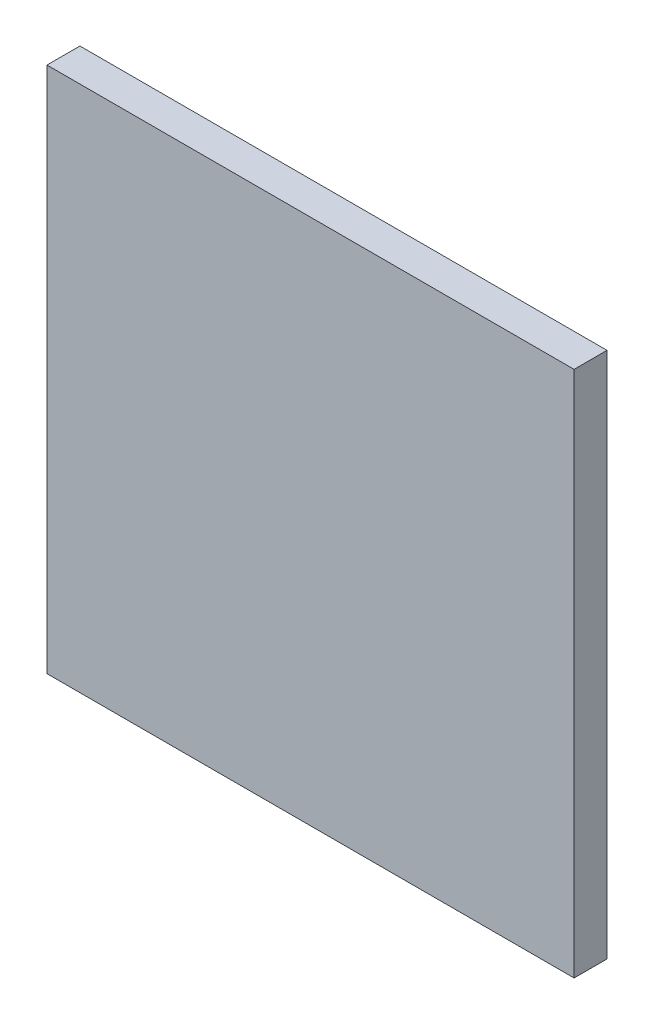
ISO-10303-21;
HEADER;
FILE_DESCRIPTION(('STEP AP214'),'2;1');
FILE_NAME('part.step','',(''),(''),'','','');
FILE_SCHEMA(('AUTOMOTIVE_DESIGN { 1 0 10303 214 1 1 1 1 }'));
ENDSEC;
DATA;
#1=APPLICATION_CONTEXT('core data for automotive mechanical design processes');
#2=APPLICATION_PROTOCOL_DEFINITION('international standard','automotive_design',2000,#1);
#3=PRODUCT_CONTEXT('',#1,'mechanical');
#4=PRODUCT('Part','Part','',(#3));
#5=PRODUCT_RELATED_PRODUCT_CATEGORY('part','',(#4));
#6=PRODUCT_DEFINITION_FORMATION('','',#4);
#7=PRODUCT_DEFINITION_CONTEXT('part definition',#1,'design');
#8=PRODUCT_DEFINITION('design','',#6,#7);
#9=PRODUCT_DEFINITION_SHAPE('','',#8);
#10=(LENGTH_UNIT() NAMED_UNIT(*) SI_UNIT(.MILLI.,.METRE.));
#11=(NAMED_UNIT(*) PLANE_ANGLE_UNIT() SI_UNIT($,.RADIAN.));
#12=(NAMED_UNIT(*) SI_UNIT($,.STERADIAN.) SOLID_ANGLE_UNIT());
#13=UNCERTAINTY_MEASURE_WITH_UNIT(LENGTH_MEASURE(1.E-05),#10,'distance_accuracy_value','');
#14=(GEOMETRIC_REPRESENTATION_CONTEXT(3) GLOBAL_UNCERTAINTY_ASSIGNED_CONTEXT((#13)) GLOBAL_UNIT_ASSIGNED_CONTEXT((#10,
#11,#12)) REPRESENTATION_CONTEXT('',''));
#15=CARTESIAN_POINT('',(0.,0.,0.));
#16=DIRECTION('',(0.,0.,1.));
#17=DIRECTION('',(1.,0.,0.));
#18=AXIS2_PLACEMENT_3D('',#15,#16,#17);
#19=CARTESIAN_POINT('',(400.,-400.,25.));
#20=DIRECTION('',(-1.,0.,0.));
#21=DIRECTION('',(0.,0.,1.));
#22=AXIS2_PLACEMENT_3D('',#19,#20,#21);
#23=PLANE('',#22);
#24=DIRECTION('',(0.,1.,0.));
#25=VECTOR('',#24,1.);
#26=CARTESIAN_POINT('',(400.,-400.,-25.));
#27=LINE('',#26,#25);
#28=CARTESIAN_POINT('',(400.,-400.,-25.));
#29=VERTEX_POINT('',#28);
#30=CARTESIAN_POINT('',(400.,400.,-25.));
#31=VERTEX_POINT('',#30);
#32=EDGE_CURVE('E97',#29,#31,#27,.T.);
#33=ORIENTED_EDGE('',*,*,#32,.T.);
#34=DIRECTION('',(0.,0.,-1.));
#35=VECTOR('',#34,1.);
#36=CARTESIAN_POINT('',(400.,400.,25.));
#37=LINE('',#36,#35);
#38=CARTESIAN_POINT('',(400.,400.,25.));
#39=VERTEX_POINT('',#38);
#40=EDGE_CURVE('E11',#39,#31,#37,.T.);
#41=ORIENTED_EDGE('',*,*,#40,.F.);
#42=DIRECTION('',(0.,1.,0.));
#43=VECTOR('',#42,1.);
#44=CARTESIAN_POINT('',(400.,-400.,25.));
#45=LINE('',#44,#43);
#46=CARTESIAN_POINT('',(400.,-400.,25.));
#47=VERTEX_POINT('',#46);
#48=EDGE_CURVE('E85',#47,#39,#45,.T.);
#49=ORIENTED_EDGE('',*,*,#48,.F.);
#50=DIRECTION('',(0.,0.,-1.));
#51=VECTOR('',#50,1.);
#52=CARTESIAN_POINT('',(400.,-400.,25.));
#53=LINE('',#52,#51);
#54=EDGE_CURVE('E93',#47,#29,#53,.T.);
#55=ORIENTED_EDGE('',*,*,#54,.T.);
#56=EDGE_LOOP('',(#33,#41,#49,#55));
#57=FACE_BOUND('',#56,.T.);
#58=ADVANCED_FACE('F34',(#57),#23,.F.);
#59=CARTESIAN_POINT('',(-400.,400.,25.));
#60=DIRECTION('',(0.,-1.,0.));
#61=DIRECTION('',(0.,0.,-1.));
#62=AXIS2_PLACEMENT_3D('',#59,#60,#61);
#63=PLANE('',#62);
#64=DIRECTION('',(-1.,0.,0.));
#65=VECTOR('',#64,1.);
#66=CARTESIAN_POINT('',(-400.,400.,-25.));
#67=LINE('',#66,#65);
#68=CARTESIAN_POINT('',(-400.,400.,-25.));
#69=VERTEX_POINT('',#68);
#70=EDGE_CURVE('E89',#31,#69,#67,.T.);
#71=ORIENTED_EDGE('',*,*,#70,.T.);
#72=DIRECTION('',(0.,0.,-1.));
#73=VECTOR('',#72,1.);
#74=CARTESIAN_POINT('',(-400.,400.,25.));
#75=LINE('',#74,#73);
#76=CARTESIAN_POINT('',(-400.,400.,25.));
#77=VERTEX_POINT('',#76);
#78=EDGE_CURVE('E42',#77,#69,#75,.T.);
#79=ORIENTED_EDGE('',*,*,#78,.F.);
#80=DIRECTION('',(-1.,0.,0.));
#81=VECTOR('',#80,1.);
#82=CARTESIAN_POINT('',(-400.,400.,25.));
#83=LINE('',#82,#81);
#84=EDGE_CURVE('E80',#39,#77,#83,.T.);
#85=ORIENTED_EDGE('',*,*,#84,.F.);
#86=ORIENTED_EDGE('',*,*,#40,.T.);
#87=EDGE_LOOP('',(#71,#79,#85,#86));
#88=FACE_BOUND('',#87,.T.);
#89=ADVANCED_FACE('F88',(#88),#63,.F.);
#90=CARTESIAN_POINT('',(-400.,-400.,25.));
#91=DIRECTION('',(1.,0.,0.));
#92=DIRECTION('',(0.,0.,-1.));
#93=AXIS2_PLACEMENT_3D('',#90,#91,#92);
#94=PLANE('',#93);
#95=DIRECTION('',(0.,-1.,0.));
#96=VECTOR('',#95,1.);
#97=CARTESIAN_POINT('',(-400.,-400.,-25.));
#98=LINE('',#97,#96);
#99=CARTESIAN_POINT('',(-400.,-400.,-25.));
#100=VERTEX_POINT('',#99);
#101=EDGE_CURVE('E67',#69,#100,#98,.T.);
#102=ORIENTED_EDGE('',*,*,#101,.T.);
#103=DIRECTION('',(0.,0.,-1.));
#104=VECTOR('',#103,1.);
#105=CARTESIAN_POINT('',(-400.,-400.,25.));
#106=LINE('',#105,#104);
#107=CARTESIAN_POINT('',(-400.,-400.,25.));
#108=VERTEX_POINT('',#107);
#109=EDGE_CURVE('E90',#108,#100,#106,.T.);
#110=ORIENTED_EDGE('',*,*,#109,.F.);
#111=DIRECTION('',(0.,-1.,0.));
#112=VECTOR('',#111,1.);
#113=CARTESIAN_POINT('',(-400.,-400.,25.));
#114=LINE('',#113,#112);
#115=EDGE_CURVE('E83',#77,#108,#114,.T.);
#116=ORIENTED_EDGE('',*,*,#115,.F.);
#117=ORIENTED_EDGE('',*,*,#78,.T.);
#118=EDGE_LOOP('',(#102,#110,#116,#117));
#119=FACE_BOUND('',#118,.T.);
#120=ADVANCED_FACE('F91',(#119),#94,.F.);
#121=CARTESIAN_POINT('',(-400.,-400.,25.));
#122=DIRECTION('',(0.,1.,0.));
#123=DIRECTION('',(0.,0.,1.));
#124=AXIS2_PLACEMENT_3D('',#121,#122,#123);
#125=PLANE('',#124);
#126=DIRECTION('',(1.,0.,0.));
#127=VECTOR('',#126,1.);
#128=CARTESIAN_POINT('',(-400.,-400.,-25.));
#129=LINE('',#128,#127);
#130=EDGE_CURVE('E73',#100,#29,#129,.T.);
#131=ORIENTED_EDGE('',*,*,#130,.T.);
#132=ORIENTED_EDGE('',*,*,#54,.F.);
#133=DIRECTION('',(1.,0.,0.));
#134=VECTOR('',#133,1.);
#135=CARTESIAN_POINT('',(-400.,-400.,25.));
#136=LINE('',#135,#134);
#137=EDGE_CURVE('E50',#108,#47,#136,.T.);
#138=ORIENTED_EDGE('',*,*,#137,.F.);
#139=ORIENTED_EDGE('',*,*,#109,.T.);
#140=EDGE_LOOP('',(#131,#132,#138,#139));
#141=FACE_BOUND('',#140,.T.);
#142=ADVANCED_FACE('F104',(#141),#125,.F.);
#143=CARTESIAN_POINT('',(0.,0.,25.));
#144=DIRECTION('',(0.,0.,-1.));
#145=DIRECTION('',(-1.,0.,0.));
#146=AXIS2_PLACEMENT_3D('',#143,#144,#145);
#147=PLANE('',#146);
#148=ORIENTED_EDGE('',*,*,#48,.T.);
#149=ORIENTED_EDGE('',*,*,#84,.T.);
#150=ORIENTED_EDGE('',*,*,#115,.T.);
#151=ORIENTED_EDGE('',*,*,#137,.T.);
#152=EDGE_LOOP('',(#148,#149,#150,#151));
#153=FACE_BOUND('',#152,.T.);
#154=ADVANCED_FACE('F81',(#153),#147,.F.);
#155=CARTESIAN_POINT('',(0.,0.,-25.));
#156=DIRECTION('',(0.,0.,-1.));
#157=DIRECTION('',(-1.,0.,0.));
#158=AXIS2_PLACEMENT_3D('',#155,#156,#157);
#159=PLANE('',#158);
#160=ORIENTED_EDGE('',*,*,#32,.F.);
#161=ORIENTED_EDGE('',*,*,#130,.F.);
#162=ORIENTED_EDGE('',*,*,#101,.F.);
#163=ORIENTED_EDGE('',*,*,#70,.F.);
#164=EDGE_LOOP('',(#160,#161,#162,#163));
#165=FACE_BOUND('',#164,.T.);
#166=ADVANCED_FACE('F107',(#165),#159,.T.);
#167=CLOSED_SHELL('',(#58,#89,#120,#142,#154,#166));
#168=MANIFOLD_SOLID_BREP('B2',#167);
#169=ADVANCED_BREP_SHAPE_REPRESENTATION('',(#18,#168),#14);
#170=SHAPE_DEFINITION_REPRESENTATION(#9,#169);
ENDSEC;
END-ISO-10303-21;
